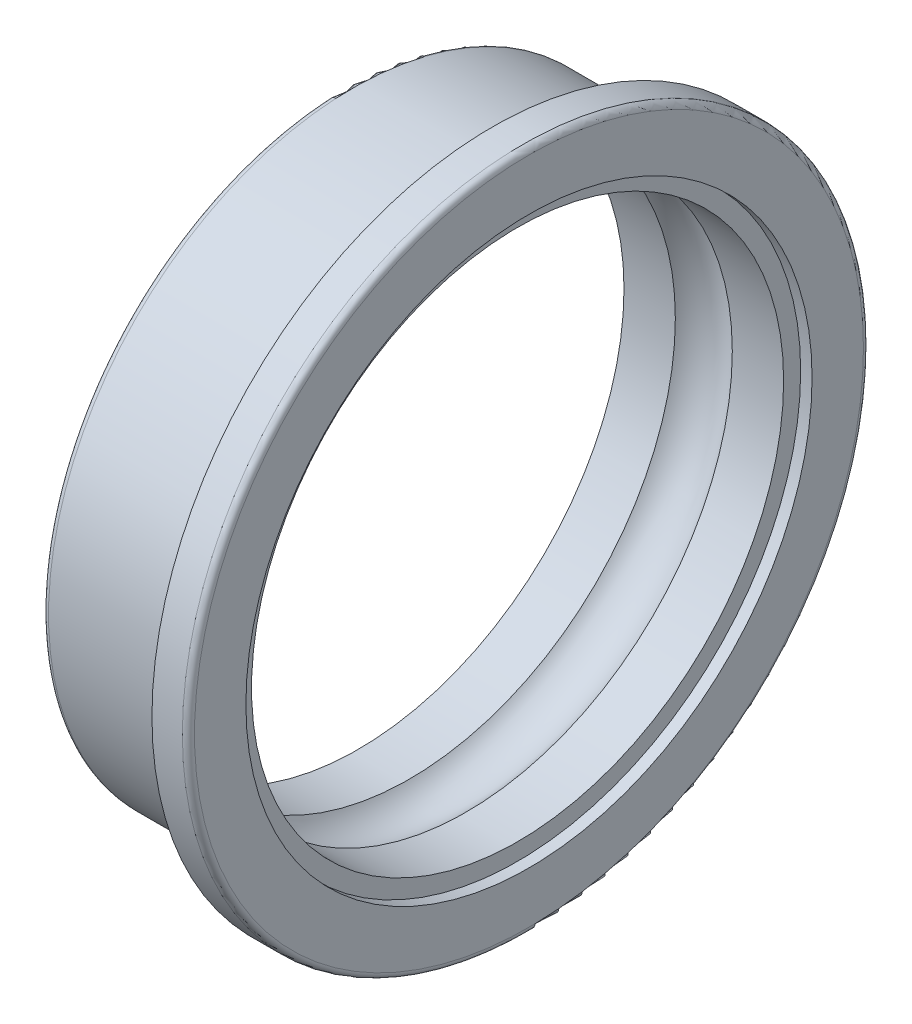
ISO-10303-21;
HEADER;
FILE_DESCRIPTION(('STEP AP214'),'2;1');
FILE_NAME('part.step','',(''),(''),'','','');
FILE_SCHEMA(('AUTOMOTIVE_DESIGN { 1 0 10303 214 1 1 1 1 }'));
ENDSEC;
DATA;
#1=APPLICATION_CONTEXT('core data for automotive mechanical design processes');
#2=APPLICATION_PROTOCOL_DEFINITION('international standard','automotive_design',2000,#1);
#3=PRODUCT_CONTEXT('',#1,'mechanical');
#4=PRODUCT('Part','Part','',(#3));
#5=PRODUCT_RELATED_PRODUCT_CATEGORY('part','',(#4));
#6=PRODUCT_DEFINITION_FORMATION('','',#4);
#7=PRODUCT_DEFINITION_CONTEXT('part definition',#1,'design');
#8=PRODUCT_DEFINITION('design','',#6,#7);
#9=PRODUCT_DEFINITION_SHAPE('','',#8);
#10=(LENGTH_UNIT() NAMED_UNIT(*) SI_UNIT(.MILLI.,.METRE.));
#11=(NAMED_UNIT(*) PLANE_ANGLE_UNIT() SI_UNIT($,.RADIAN.));
#12=(NAMED_UNIT(*) SI_UNIT($,.STERADIAN.) SOLID_ANGLE_UNIT());
#13=UNCERTAINTY_MEASURE_WITH_UNIT(LENGTH_MEASURE(1.E-05),#10,'distance_accuracy_value','');
#14=(GEOMETRIC_REPRESENTATION_CONTEXT(3) GLOBAL_UNCERTAINTY_ASSIGNED_CONTEXT((#13)) GLOBAL_UNIT_ASSIGNED_CONTEXT((#10,
#11,#12)) REPRESENTATION_CONTEXT('',''));
#15=CARTESIAN_POINT('',(0.,0.,0.));
#16=DIRECTION('',(0.,0.,1.));
#17=DIRECTION('',(1.,0.,0.));
#18=AXIS2_PLACEMENT_3D('',#15,#16,#17);
#19=CARTESIAN_POINT('',(0.,4.9,0.));
#20=DIRECTION('',(-1.,0.,0.));
#21=DIRECTION('',(0.,0.,1.));
#22=AXIS2_PLACEMENT_3D('',#19,#20,#21);
#23=PLANE('',#22);
#24=CARTESIAN_POINT('',(0.,0.,0.));
#25=DIRECTION('',(1.,0.,0.));
#26=DIRECTION('',(0.,0.,-1.));
#27=AXIS2_PLACEMENT_3D('',#24,#25,#26);
#28=CIRCLE('',#27,4.655);
#29=CARTESIAN_POINT('',(0.,0.,-4.655));
#30=VERTEX_POINT('',#29);
#31=EDGE_CURVE('E5',#30,#30,#28,.T.);
#32=ORIENTED_EDGE('',*,*,#31,.T.);
#33=EDGE_LOOP('',(#32));
#34=FACE_BOUND('',#33,.T.);
#35=CARTESIAN_POINT('',(0.,0.,0.));
#36=DIRECTION('',(1.,0.,0.));
#37=DIRECTION('',(0.,0.,-1.));
#38=AXIS2_PLACEMENT_3D('',#35,#36,#37);
#39=CIRCLE('',#38,4.89999999578539);
#40=CARTESIAN_POINT('',(0.,0.,-4.89999999578539));
#41=VERTEX_POINT('',#40);
#42=EDGE_CURVE('E9',#41,#41,#39,.T.);
#43=ORIENTED_EDGE('',*,*,#42,.F.);
#44=EDGE_LOOP('',(#43));
#45=FACE_BOUND('',#44,.T.);
#46=ADVANCED_FACE('F13',(#34,#45),#23,.T.);
#47=CARTESIAN_POINT('',(3.,0.,0.));
#48=DIRECTION('',(1.,0.,0.));
#49=DIRECTION('',(0.,0.,-1.));
#50=AXIS2_PLACEMENT_3D('',#47,#48,#49);
#51=CYLINDRICAL_SURFACE('',#50,4.655);
#52=CARTESIAN_POINT('',(0.1875,0.,0.));
#53=DIRECTION('',(1.,0.,0.));
#54=DIRECTION('',(0.,0.,-1.));
#55=AXIS2_PLACEMENT_3D('',#52,#53,#54);
#56=CIRCLE('',#55,4.655);
#57=CARTESIAN_POINT('',(0.1875,0.,-4.655));
#58=VERTEX_POINT('',#57);
#59=EDGE_CURVE('E24',#58,#58,#56,.T.);
#60=ORIENTED_EDGE('',*,*,#59,.T.);
#61=EDGE_LOOP('',(#60));
#62=FACE_BOUND('',#61,.T.);
#63=ORIENTED_EDGE('',*,*,#31,.F.);
#64=EDGE_LOOP('',(#63));
#65=FACE_BOUND('',#64,.T.);
#66=ADVANCED_FACE('F30',(#62,#65),#51,.F.);
#67=CARTESIAN_POINT('',(0.0999999999999217,0.,0.));
#68=DIRECTION('',(1.,0.,0.));
#69=DIRECTION('',(0.,0.,-1.));
#70=AXIS2_PLACEMENT_3D('',#67,#68,#69);
#71=TOROIDAL_SURFACE('',#70,4.90000000000008,0.0999999999999222);
#72=ORIENTED_EDGE('',*,*,#42,.T.);
#73=EDGE_LOOP('',(#72));
#74=FACE_BOUND('',#73,.T.);
#75=CARTESIAN_POINT('',(0.1,0.,0.));
#76=DIRECTION('',(1.,0.,0.));
#77=DIRECTION('',(0.,0.,-1.));
#78=AXIS2_PLACEMENT_3D('',#75,#76,#77);
#79=CIRCLE('',#78,5.);
#80=CARTESIAN_POINT('',(0.1,0.,-5.));
#81=VERTEX_POINT('',#80);
#82=EDGE_CURVE('E39',#81,#81,#79,.T.);
#83=ORIENTED_EDGE('',*,*,#82,.F.);
#84=EDGE_LOOP('',(#83));
#85=FACE_BOUND('',#84,.T.);
#86=ADVANCED_FACE('F43',(#74,#85),#71,.T.);
#87=CARTESIAN_POINT('',(0.1875,4.655,0.));
#88=DIRECTION('',(-1.,0.,0.));
#89=DIRECTION('',(0.,0.,1.));
#90=AXIS2_PLACEMENT_3D('',#87,#88,#89);
#91=PLANE('',#90);
#92=CARTESIAN_POINT('',(0.1875,0.,0.));
#93=DIRECTION('',(1.,0.,0.));
#94=DIRECTION('',(0.,0.,-1.));
#95=AXIS2_PLACEMENT_3D('',#92,#93,#94);
#96=CIRCLE('',#95,4.375);
#97=CARTESIAN_POINT('',(0.1875,0.,-4.375));
#98=VERTEX_POINT('',#97);
#99=EDGE_CURVE('E50',#98,#98,#96,.T.);
#100=ORIENTED_EDGE('',*,*,#99,.T.);
#101=EDGE_LOOP('',(#100));
#102=FACE_BOUND('',#101,.T.);
#103=ORIENTED_EDGE('',*,*,#59,.F.);
#104=EDGE_LOOP('',(#103));
#105=FACE_BOUND('',#104,.T.);
#106=ADVANCED_FACE('F56',(#102,#105),#91,.T.);
#107=CARTESIAN_POINT('',(3.,0.,0.));
#108=DIRECTION('',(1.,0.,0.));
#109=DIRECTION('',(0.,0.,-1.));
#110=AXIS2_PLACEMENT_3D('',#107,#108,#109);
#111=CYLINDRICAL_SURFACE('',#110,5.);
#112=ORIENTED_EDGE('',*,*,#82,.T.);
#113=EDGE_LOOP('',(#112));
#114=FACE_BOUND('',#113,.T.);
#115=CARTESIAN_POINT('',(2.4,0.,0.));
#116=DIRECTION('',(1.,0.,0.));
#117=DIRECTION('',(0.,0.,-1.));
#118=AXIS2_PLACEMENT_3D('',#115,#116,#117);
#119=CIRCLE('',#118,5.);
#120=CARTESIAN_POINT('',(2.4,0.,-5.));
#121=VERTEX_POINT('',#120);
#122=EDGE_CURVE('E65',#121,#121,#119,.T.);
#123=ORIENTED_EDGE('',*,*,#122,.F.);
#124=EDGE_LOOP('',(#123));
#125=FACE_BOUND('',#124,.T.);
#126=ADVANCED_FACE('F69',(#114,#125),#111,.T.);
#127=CARTESIAN_POINT('',(3.,0.,0.));
#128=DIRECTION('',(1.,0.,0.));
#129=DIRECTION('',(0.,0.,-1.));
#130=AXIS2_PLACEMENT_3D('',#127,#128,#129);
#131=CYLINDRICAL_SURFACE('',#130,4.375);
#132=CARTESIAN_POINT('',(1.0316251501201,0.,0.));
#133=DIRECTION('',(1.,0.,0.));
#134=DIRECTION('',(0.,0.,-1.));
#135=AXIS2_PLACEMENT_3D('',#132,#133,#134);
#136=CIRCLE('',#135,4.375);
#137=CARTESIAN_POINT('',(1.0316251501201,0.,-4.375));
#138=VERTEX_POINT('',#137);
#139=EDGE_CURVE('E76',#138,#138,#136,.T.);
#140=ORIENTED_EDGE('',*,*,#139,.T.);
#141=EDGE_LOOP('',(#140));
#142=FACE_BOUND('',#141,.T.);
#143=ORIENTED_EDGE('',*,*,#99,.F.);
#144=EDGE_LOOP('',(#143));
#145=FACE_BOUND('',#144,.T.);
#146=ADVANCED_FACE('F82',(#142,#145),#131,.F.);
#147=CARTESIAN_POINT('',(2.4,5.6,0.));
#148=DIRECTION('',(-1.,0.,0.));
#149=DIRECTION('',(0.,0.,1.));
#150=AXIS2_PLACEMENT_3D('',#147,#148,#149);
#151=PLANE('',#150);
#152=ORIENTED_EDGE('',*,*,#122,.T.);
#153=EDGE_LOOP('',(#152));
#154=FACE_BOUND('',#153,.T.);
#155=CARTESIAN_POINT('',(2.4,0.,0.));
#156=DIRECTION('',(1.,0.,0.));
#157=DIRECTION('',(0.,0.,-1.));
#158=AXIS2_PLACEMENT_3D('',#155,#156,#157);
#159=CIRCLE('',#158,5.6);
#160=CARTESIAN_POINT('',(2.4,0.,-5.6));
#161=VERTEX_POINT('',#160);
#162=EDGE_CURVE('E91',#161,#161,#159,.T.);
#163=ORIENTED_EDGE('',*,*,#162,.F.);
#164=EDGE_LOOP('',(#163));
#165=FACE_BOUND('',#164,.T.);
#166=ADVANCED_FACE('F95',(#154,#165),#151,.T.);
#167=CARTESIAN_POINT('',(1.5,0.,0.));
#168=DIRECTION('',(1.,0.,0.));
#169=DIRECTION('',(0.,0.,-1.));
#170=AXIS2_PLACEMENT_3D('',#167,#168,#169);
#171=TOROIDAL_SURFACE('',#170,4.,0.600000000000043);
#172=ORIENTED_EDGE('',*,*,#139,.F.);
#173=EDGE_LOOP('',(#172));
#174=FACE_BOUND('',#173,.T.);
#175=CARTESIAN_POINT('',(1.9683748498799,0.,0.));
#176=DIRECTION('',(1.,0.,0.));
#177=DIRECTION('',(0.,0.,-1.));
#178=AXIS2_PLACEMENT_3D('',#175,#176,#177);
#179=CIRCLE('',#178,4.375);
#180=CARTESIAN_POINT('',(1.9683748498799,0.,-4.375));
#181=VERTEX_POINT('',#180);
#182=EDGE_CURVE('E104',#181,#181,#179,.T.);
#183=ORIENTED_EDGE('',*,*,#182,.T.);
#184=EDGE_LOOP('',(#183));
#185=FACE_BOUND('',#184,.T.);
#186=ADVANCED_FACE('F108',(#174,#185),#171,.F.);
#187=CARTESIAN_POINT('',(3.,0.,0.));
#188=DIRECTION('',(1.,0.,0.));
#189=DIRECTION('',(0.,0.,-1.));
#190=AXIS2_PLACEMENT_3D('',#187,#188,#189);
#191=CYLINDRICAL_SURFACE('',#190,5.6);
#192=ORIENTED_EDGE('',*,*,#162,.T.);
#193=EDGE_LOOP('',(#192));
#194=FACE_BOUND('',#193,.T.);
#195=CARTESIAN_POINT('',(2.9,0.,0.));
#196=DIRECTION('',(1.,0.,0.));
#197=DIRECTION('',(0.,0.,-1.));
#198=AXIS2_PLACEMENT_3D('',#195,#196,#197);
#199=CIRCLE('',#198,5.6);
#200=CARTESIAN_POINT('',(2.9,0.,-5.6));
#201=VERTEX_POINT('',#200);
#202=EDGE_CURVE('E117',#201,#201,#199,.T.);
#203=ORIENTED_EDGE('',*,*,#202,.F.);
#204=EDGE_LOOP('',(#203));
#205=FACE_BOUND('',#204,.T.);
#206=ADVANCED_FACE('F121',(#194,#205),#191,.T.);
#207=CARTESIAN_POINT('',(3.,0.,0.));
#208=DIRECTION('',(1.,0.,0.));
#209=DIRECTION('',(0.,0.,-1.));
#210=AXIS2_PLACEMENT_3D('',#207,#208,#209);
#211=CYLINDRICAL_SURFACE('',#210,4.375);
#212=CARTESIAN_POINT('',(2.8125,0.,0.));
#213=DIRECTION('',(1.,0.,0.));
#214=DIRECTION('',(0.,0.,-1.));
#215=AXIS2_PLACEMENT_3D('',#212,#213,#214);
#216=CIRCLE('',#215,4.375);
#217=CARTESIAN_POINT('',(2.8125,0.,-4.375));
#218=VERTEX_POINT('',#217);
#219=EDGE_CURVE('E128',#218,#218,#216,.T.);
#220=ORIENTED_EDGE('',*,*,#219,.T.);
#221=EDGE_LOOP('',(#220));
#222=FACE_BOUND('',#221,.T.);
#223=ORIENTED_EDGE('',*,*,#182,.F.);
#224=EDGE_LOOP('',(#223));
#225=FACE_BOUND('',#224,.T.);
#226=ADVANCED_FACE('F134',(#222,#225),#211,.F.);
#227=CARTESIAN_POINT('',(2.90000000000015,0.,0.));
#228=DIRECTION('',(1.,0.,0.));
#229=DIRECTION('',(0.,0.,-1.));
#230=AXIS2_PLACEMENT_3D('',#227,#228,#229);
#231=TOROIDAL_SURFACE('',#230,5.50000000000015,0.0999999999998467);
#232=ORIENTED_EDGE('',*,*,#202,.T.);
#233=EDGE_LOOP('',(#232));
#234=FACE_BOUND('',#233,.T.);
#235=CARTESIAN_POINT('',(3.,0.,0.));
#236=DIRECTION('',(1.,0.,0.));
#237=DIRECTION('',(0.,0.,-1.));
#238=AXIS2_PLACEMENT_3D('',#235,#236,#237);
#239=CIRCLE('',#238,5.49999998211876);
#240=CARTESIAN_POINT('',(3.,0.,-5.49999998211876));
#241=VERTEX_POINT('',#240);
#242=EDGE_CURVE('E143',#241,#241,#239,.T.);
#243=ORIENTED_EDGE('',*,*,#242,.F.);
#244=EDGE_LOOP('',(#243));
#245=FACE_BOUND('',#244,.T.);
#246=ADVANCED_FACE('F147',(#234,#245),#231,.T.);
#247=CARTESIAN_POINT('',(2.8125,4.375,0.));
#248=DIRECTION('',(1.,0.,0.));
#249=DIRECTION('',(0.,0.,-1.));
#250=AXIS2_PLACEMENT_3D('',#247,#248,#249);
#251=PLANE('',#250);
#252=CARTESIAN_POINT('',(2.8125,0.,0.));
#253=DIRECTION('',(1.,0.,0.));
#254=DIRECTION('',(0.,0.,-1.));
#255=AXIS2_PLACEMENT_3D('',#252,#253,#254);
#256=CIRCLE('',#255,4.655);
#257=CARTESIAN_POINT('',(2.8125,0.,-4.655));
#258=VERTEX_POINT('',#257);
#259=EDGE_CURVE('E154',#258,#258,#256,.T.);
#260=ORIENTED_EDGE('',*,*,#259,.T.);
#261=EDGE_LOOP('',(#260));
#262=FACE_BOUND('',#261,.T.);
#263=ORIENTED_EDGE('',*,*,#219,.F.);
#264=EDGE_LOOP('',(#263));
#265=FACE_BOUND('',#264,.T.);
#266=ADVANCED_FACE('F160',(#262,#265),#251,.T.);
#267=CARTESIAN_POINT('',(3.,4.655,0.));
#268=DIRECTION('',(1.,0.,0.));
#269=DIRECTION('',(0.,0.,-1.));
#270=AXIS2_PLACEMENT_3D('',#267,#268,#269);
#271=PLANE('',#270);
#272=ORIENTED_EDGE('',*,*,#242,.T.);
#273=EDGE_LOOP('',(#272));
#274=FACE_BOUND('',#273,.T.);
#275=CARTESIAN_POINT('',(3.,0.,0.));
#276=DIRECTION('',(1.,0.,0.));
#277=DIRECTION('',(0.,0.,-1.));
#278=AXIS2_PLACEMENT_3D('',#275,#276,#277);
#279=CIRCLE('',#278,4.655);
#280=CARTESIAN_POINT('',(3.,0.,-4.655));
#281=VERTEX_POINT('',#280);
#282=EDGE_CURVE('E169',#281,#281,#279,.T.);
#283=ORIENTED_EDGE('',*,*,#282,.F.);
#284=EDGE_LOOP('',(#283));
#285=FACE_BOUND('',#284,.T.);
#286=ADVANCED_FACE('F173',(#274,#285),#271,.T.);
#287=CARTESIAN_POINT('',(3.,0.,0.));
#288=DIRECTION('',(1.,0.,0.));
#289=DIRECTION('',(0.,0.,-1.));
#290=AXIS2_PLACEMENT_3D('',#287,#288,#289);
#291=CYLINDRICAL_SURFACE('',#290,4.655);
#292=ORIENTED_EDGE('',*,*,#282,.T.);
#293=EDGE_LOOP('',(#292));
#294=FACE_BOUND('',#293,.T.);
#295=ORIENTED_EDGE('',*,*,#259,.F.);
#296=EDGE_LOOP('',(#295));
#297=FACE_BOUND('',#296,.T.);
#298=ADVANCED_FACE('F184',(#294,#297),#291,.F.);
#299=CLOSED_SHELL('',(#46,#66,#86,#106,#126,#146,#166,#186,#206,#226,#246,#266,#286,#298));
#300=MANIFOLD_SOLID_BREP('B1',#299);
#301=ADVANCED_BREP_SHAPE_REPRESENTATION('',(#18,#300),#14);
#302=SHAPE_DEFINITION_REPRESENTATION(#9,#301);
ENDSEC;
END-ISO-10303-21;
